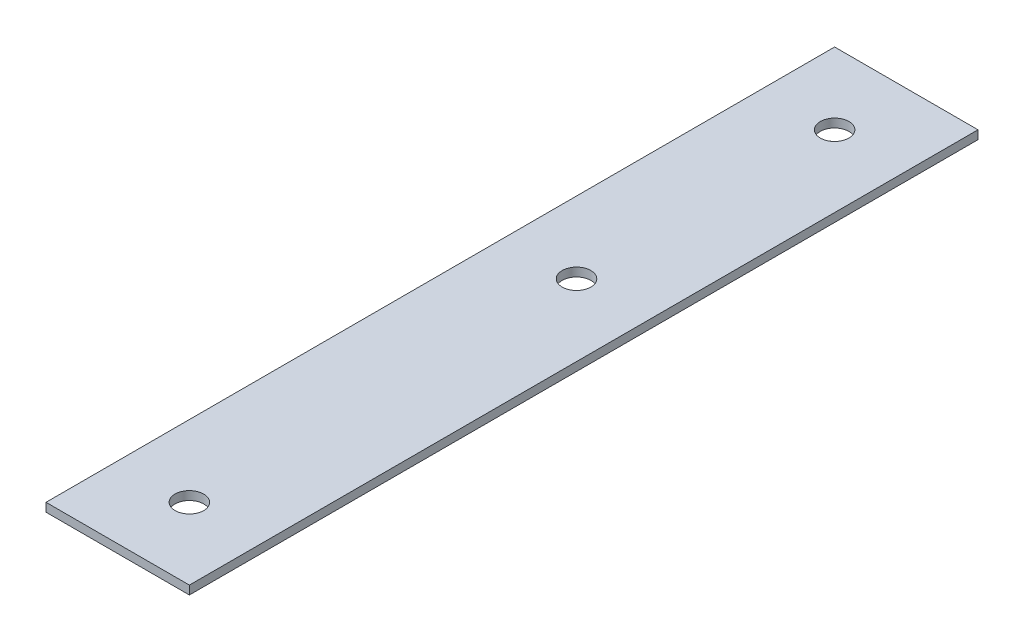
ISO-10303-21;
HEADER;
FILE_DESCRIPTION(('STEP AP214'),'2;1');
FILE_NAME('part.step','',(''),(''),'','','');
FILE_SCHEMA(('AUTOMOTIVE_DESIGN { 1 0 10303 214 1 1 1 1 }'));
ENDSEC;
DATA;
#1=APPLICATION_CONTEXT('core data for automotive mechanical design processes');
#2=APPLICATION_PROTOCOL_DEFINITION('international standard','automotive_design',2000,#1);
#3=PRODUCT_CONTEXT('',#1,'mechanical');
#4=PRODUCT('Part','Part','',(#3));
#5=PRODUCT_RELATED_PRODUCT_CATEGORY('part','',(#4));
#6=PRODUCT_DEFINITION_FORMATION('','',#4);
#7=PRODUCT_DEFINITION_CONTEXT('part definition',#1,'design');
#8=PRODUCT_DEFINITION('design','',#6,#7);
#9=PRODUCT_DEFINITION_SHAPE('','',#8);
#10=(LENGTH_UNIT() NAMED_UNIT(*) SI_UNIT(.MILLI.,.METRE.));
#11=(NAMED_UNIT(*) PLANE_ANGLE_UNIT() SI_UNIT($,.RADIAN.));
#12=(NAMED_UNIT(*) SI_UNIT($,.STERADIAN.) SOLID_ANGLE_UNIT());
#13=UNCERTAINTY_MEASURE_WITH_UNIT(LENGTH_MEASURE(1.E-05),#10,'distance_accuracy_value','');
#14=(GEOMETRIC_REPRESENTATION_CONTEXT(3) GLOBAL_UNCERTAINTY_ASSIGNED_CONTEXT((#13)) GLOBAL_UNIT_ASSIGNED_CONTEXT((#10,
#11,#12)) REPRESENTATION_CONTEXT('',''));
#15=CARTESIAN_POINT('',(0.,0.,0.));
#16=DIRECTION('',(0.,0.,1.));
#17=DIRECTION('',(1.,0.,0.));
#18=AXIS2_PLACEMENT_3D('',#15,#16,#17);
#19=CARTESIAN_POINT('',(0.,3.,0.));
#20=DIRECTION('',(1.,0.,0.));
#21=DIRECTION('',(0.,0.,-1.));
#22=AXIS2_PLACEMENT_3D('',#19,#20,#21);
#23=PLANE('',#22);
#24=DIRECTION('',(0.,0.,1.));
#25=VECTOR('',#24,1.);
#26=CARTESIAN_POINT('',(0.,0.,0.));
#27=LINE('',#26,#25);
#28=CARTESIAN_POINT('',(0.,0.,-275.));
#29=VERTEX_POINT('',#28);
#30=CARTESIAN_POINT('',(0.,0.,0.));
#31=VERTEX_POINT('',#30);
#32=EDGE_CURVE('E99',#29,#31,#27,.T.);
#33=ORIENTED_EDGE('',*,*,#32,.T.);
#34=DIRECTION('',(0.,-1.,0.));
#35=VECTOR('',#34,1.);
#36=CARTESIAN_POINT('',(0.,3.,0.));
#37=LINE('',#36,#35);
#38=CARTESIAN_POINT('',(0.,3.,0.));
#39=VERTEX_POINT('',#38);
#40=EDGE_CURVE('E11',#39,#31,#37,.T.);
#41=ORIENTED_EDGE('',*,*,#40,.F.);
#42=DIRECTION('',(0.,0.,1.));
#43=VECTOR('',#42,1.);
#44=CARTESIAN_POINT('',(0.,3.,0.));
#45=LINE('',#44,#43);
#46=CARTESIAN_POINT('',(0.,3.,-275.));
#47=VERTEX_POINT('',#46);
#48=EDGE_CURVE('E87',#47,#39,#45,.T.);
#49=ORIENTED_EDGE('',*,*,#48,.F.);
#50=DIRECTION('',(0.,-1.,0.));
#51=VECTOR('',#50,1.);
#52=CARTESIAN_POINT('',(0.,3.,-275.));
#53=LINE('',#52,#51);
#54=EDGE_CURVE('E95',#47,#29,#53,.T.);
#55=ORIENTED_EDGE('',*,*,#54,.T.);
#56=EDGE_LOOP('',(#33,#41,#49,#55));
#57=FACE_BOUND('',#56,.T.);
#58=ADVANCED_FACE('F36',(#57),#23,.F.);
#59=CARTESIAN_POINT('',(0.,3.,0.));
#60=DIRECTION('',(0.,0.,-1.));
#61=DIRECTION('',(-1.,0.,0.));
#62=AXIS2_PLACEMENT_3D('',#59,#60,#61);
#63=PLANE('',#62);
#64=DIRECTION('',(1.,0.,0.));
#65=VECTOR('',#64,1.);
#66=CARTESIAN_POINT('',(0.,0.,0.));
#67=LINE('',#66,#65);
#68=CARTESIAN_POINT('',(50.,0.,0.));
#69=VERTEX_POINT('',#68);
#70=EDGE_CURVE('E91',#31,#69,#67,.T.);
#71=ORIENTED_EDGE('',*,*,#70,.T.);
#72=DIRECTION('',(0.,-1.,0.));
#73=VECTOR('',#72,1.);
#74=CARTESIAN_POINT('',(50.,3.,0.));
#75=LINE('',#74,#73);
#76=CARTESIAN_POINT('',(50.,3.,0.));
#77=VERTEX_POINT('',#76);
#78=EDGE_CURVE('E44',#77,#69,#75,.T.);
#79=ORIENTED_EDGE('',*,*,#78,.F.);
#80=DIRECTION('',(1.,0.,0.));
#81=VECTOR('',#80,1.);
#82=CARTESIAN_POINT('',(0.,3.,0.));
#83=LINE('',#82,#81);
#84=EDGE_CURVE('E82',#39,#77,#83,.T.);
#85=ORIENTED_EDGE('',*,*,#84,.F.);
#86=ORIENTED_EDGE('',*,*,#40,.T.);
#87=EDGE_LOOP('',(#71,#79,#85,#86));
#88=FACE_BOUND('',#87,.T.);
#89=ADVANCED_FACE('F90',(#88),#63,.F.);
#90=CARTESIAN_POINT('',(50.,3.,0.));
#91=DIRECTION('',(-1.,0.,0.));
#92=DIRECTION('',(0.,0.,1.));
#93=AXIS2_PLACEMENT_3D('',#90,#91,#92);
#94=PLANE('',#93);
#95=DIRECTION('',(0.,0.,-1.));
#96=VECTOR('',#95,1.);
#97=CARTESIAN_POINT('',(50.,0.,0.));
#98=LINE('',#97,#96);
#99=CARTESIAN_POINT('',(50.,0.,-275.));
#100=VERTEX_POINT('',#99);
#101=EDGE_CURVE('E69',#69,#100,#98,.T.);
#102=ORIENTED_EDGE('',*,*,#101,.T.);
#103=DIRECTION('',(0.,-1.,0.));
#104=VECTOR('',#103,1.);
#105=CARTESIAN_POINT('',(50.,3.,-275.));
#106=LINE('',#105,#104);
#107=CARTESIAN_POINT('',(50.,3.,-275.));
#108=VERTEX_POINT('',#107);
#109=EDGE_CURVE('E92',#108,#100,#106,.T.);
#110=ORIENTED_EDGE('',*,*,#109,.F.);
#111=DIRECTION('',(0.,0.,-1.));
#112=VECTOR('',#111,1.);
#113=CARTESIAN_POINT('',(50.,3.,0.));
#114=LINE('',#113,#112);
#115=EDGE_CURVE('E85',#77,#108,#114,.T.);
#116=ORIENTED_EDGE('',*,*,#115,.F.);
#117=ORIENTED_EDGE('',*,*,#78,.T.);
#118=EDGE_LOOP('',(#102,#110,#116,#117));
#119=FACE_BOUND('',#118,.T.);
#120=ADVANCED_FACE('F93',(#119),#94,.F.);
#121=CARTESIAN_POINT('',(0.,3.,-275.));
#122=DIRECTION('',(0.,0.,1.));
#123=DIRECTION('',(1.,0.,0.));
#124=AXIS2_PLACEMENT_3D('',#121,#122,#123);
#125=PLANE('',#124);
#126=DIRECTION('',(-1.,0.,0.));
#127=VECTOR('',#126,1.);
#128=CARTESIAN_POINT('',(0.,0.,-275.));
#129=LINE('',#128,#127);
#130=EDGE_CURVE('E75',#100,#29,#129,.T.);
#131=ORIENTED_EDGE('',*,*,#130,.T.);
#132=ORIENTED_EDGE('',*,*,#54,.F.);
#133=DIRECTION('',(-1.,0.,0.));
#134=VECTOR('',#133,1.);
#135=CARTESIAN_POINT('',(0.,3.,-275.));
#136=LINE('',#135,#134);
#137=EDGE_CURVE('E52',#108,#47,#136,.T.);
#138=ORIENTED_EDGE('',*,*,#137,.F.);
#139=ORIENTED_EDGE('',*,*,#109,.T.);
#140=EDGE_LOOP('',(#131,#132,#138,#139));
#141=FACE_BOUND('',#140,.T.);
#142=ADVANCED_FACE('F107',(#141),#125,.F.);
#143=CARTESIAN_POINT('',(0.,3.,0.));
#144=DIRECTION('',(0.,-1.,0.));
#145=DIRECTION('',(0.,0.,-1.));
#146=AXIS2_PLACEMENT_3D('',#143,#144,#145);
#147=PLANE('',#146);
#148=CARTESIAN_POINT('',(25.,3.,-250.));
#149=DIRECTION('',(0.,1.,0.));
#150=DIRECTION('',(0.,0.,1.));
#151=AXIS2_PLACEMENT_3D('',#148,#149,#150);
#152=CIRCLE('',#151,5.);
#153=CARTESIAN_POINT('',(25.,3.,-245.));
#154=VERTEX_POINT('',#153);
#155=EDGE_CURVE('E125',#154,#154,#152,.T.);
#156=ORIENTED_EDGE('',*,*,#155,.F.);
#157=EDGE_LOOP('',(#156));
#158=FACE_BOUND('',#157,.T.);
#159=CARTESIAN_POINT('',(25.,3.,-25.));
#160=DIRECTION('',(0.,1.,0.));
#161=DIRECTION('',(0.,0.,1.));
#162=AXIS2_PLACEMENT_3D('',#159,#160,#161);
#163=CIRCLE('',#162,5.);
#164=CARTESIAN_POINT('',(25.,3.,-20.));
#165=VERTEX_POINT('',#164);
#166=EDGE_CURVE('E119',#165,#165,#163,.T.);
#167=ORIENTED_EDGE('',*,*,#166,.F.);
#168=EDGE_LOOP('',(#167));
#169=FACE_BOUND('',#168,.T.);
#170=CARTESIAN_POINT('',(25.,3.,-160.));
#171=DIRECTION('',(0.,1.,0.));
#172=DIRECTION('',(0.,0.,1.));
#173=AXIS2_PLACEMENT_3D('',#170,#171,#172);
#174=CIRCLE('',#173,5.);
#175=CARTESIAN_POINT('',(25.,3.,-155.));
#176=VERTEX_POINT('',#175);
#177=EDGE_CURVE('E113',#176,#176,#174,.T.);
#178=ORIENTED_EDGE('',*,*,#177,.F.);
#179=EDGE_LOOP('',(#178));
#180=FACE_BOUND('',#179,.T.);
#181=ORIENTED_EDGE('',*,*,#48,.T.);
#182=ORIENTED_EDGE('',*,*,#84,.T.);
#183=ORIENTED_EDGE('',*,*,#115,.T.);
#184=ORIENTED_EDGE('',*,*,#137,.T.);
#185=EDGE_LOOP('',(#181,#182,#183,#184));
#186=FACE_BOUND('',#185,.T.);
#187=ADVANCED_FACE('F83',(#158,#169,#180,#186),#147,.F.);
#188=CARTESIAN_POINT('',(0.,0.,0.));
#189=DIRECTION('',(0.,-1.,0.));
#190=DIRECTION('',(0.,0.,-1.));
#191=AXIS2_PLACEMENT_3D('',#188,#189,#190);
#192=PLANE('',#191);
#193=CARTESIAN_POINT('',(25.,0.,-250.));
#194=DIRECTION('',(0.,1.,0.));
#195=DIRECTION('',(0.,0.,1.));
#196=AXIS2_PLACEMENT_3D('',#193,#194,#195);
#197=CIRCLE('',#196,5.);
#198=CARTESIAN_POINT('',(25.,0.,-245.));
#199=VERTEX_POINT('',#198);
#200=EDGE_CURVE('E102',#199,#199,#197,.T.);
#201=ORIENTED_EDGE('',*,*,#200,.T.);
#202=EDGE_LOOP('',(#201));
#203=FACE_BOUND('',#202,.T.);
#204=CARTESIAN_POINT('',(25.,0.,-25.));
#205=DIRECTION('',(0.,1.,0.));
#206=DIRECTION('',(0.,0.,1.));
#207=AXIS2_PLACEMENT_3D('',#204,#205,#206);
#208=CIRCLE('',#207,5.);
#209=CARTESIAN_POINT('',(25.,0.,-20.));
#210=VERTEX_POINT('',#209);
#211=EDGE_CURVE('E122',#210,#210,#208,.T.);
#212=ORIENTED_EDGE('',*,*,#211,.T.);
#213=EDGE_LOOP('',(#212));
#214=FACE_BOUND('',#213,.T.);
#215=CARTESIAN_POINT('',(25.,0.,-160.));
#216=DIRECTION('',(0.,1.,0.));
#217=DIRECTION('',(0.,0.,1.));
#218=AXIS2_PLACEMENT_3D('',#215,#216,#217);
#219=CIRCLE('',#218,5.);
#220=CARTESIAN_POINT('',(25.,0.,-155.));
#221=VERTEX_POINT('',#220);
#222=EDGE_CURVE('E116',#221,#221,#219,.T.);
#223=ORIENTED_EDGE('',*,*,#222,.T.);
#224=EDGE_LOOP('',(#223));
#225=FACE_BOUND('',#224,.T.);
#226=ORIENTED_EDGE('',*,*,#32,.F.);
#227=ORIENTED_EDGE('',*,*,#130,.F.);
#228=ORIENTED_EDGE('',*,*,#101,.F.);
#229=ORIENTED_EDGE('',*,*,#70,.F.);
#230=EDGE_LOOP('',(#226,#227,#228,#229));
#231=FACE_BOUND('',#230,.T.);
#232=ADVANCED_FACE('F110',(#203,#214,#225,#231),#192,.T.);
#233=CARTESIAN_POINT('',(25.,0.,-160.));
#234=DIRECTION('',(0.,1.,0.));
#235=DIRECTION('',(0.,0.,1.));
#236=AXIS2_PLACEMENT_3D('',#233,#234,#235);
#237=CYLINDRICAL_SURFACE('',#236,5.);
#238=ORIENTED_EDGE('',*,*,#222,.F.);
#239=EDGE_LOOP('',(#238));
#240=FACE_BOUND('',#239,.T.);
#241=ORIENTED_EDGE('',*,*,#177,.T.);
#242=EDGE_LOOP('',(#241));
#243=FACE_BOUND('',#242,.T.);
#244=ADVANCED_FACE('F147',(#240,#243),#237,.F.);
#245=CARTESIAN_POINT('',(25.,0.,-25.));
#246=DIRECTION('',(0.,1.,0.));
#247=DIRECTION('',(0.,0.,1.));
#248=AXIS2_PLACEMENT_3D('',#245,#246,#247);
#249=CYLINDRICAL_SURFACE('',#248,5.);
#250=ORIENTED_EDGE('',*,*,#211,.F.);
#251=EDGE_LOOP('',(#250));
#252=FACE_BOUND('',#251,.T.);
#253=ORIENTED_EDGE('',*,*,#166,.T.);
#254=EDGE_LOOP('',(#253));
#255=FACE_BOUND('',#254,.T.);
#256=ADVANCED_FACE('F136',(#252,#255),#249,.F.);
#257=CARTESIAN_POINT('',(25.,0.,-250.));
#258=DIRECTION('',(0.,1.,0.));
#259=DIRECTION('',(0.,0.,1.));
#260=AXIS2_PLACEMENT_3D('',#257,#258,#259);
#261=CYLINDRICAL_SURFACE('',#260,5.);
#262=ORIENTED_EDGE('',*,*,#200,.F.);
#263=EDGE_LOOP('',(#262));
#264=FACE_BOUND('',#263,.T.);
#265=ORIENTED_EDGE('',*,*,#155,.T.);
#266=EDGE_LOOP('',(#265));
#267=FACE_BOUND('',#266,.T.);
#268=ADVANCED_FACE('F133',(#264,#267),#261,.F.);
#269=CLOSED_SHELL('',(#58,#89,#120,#142,#187,#232,#244,#256,#268));
#270=MANIFOLD_SOLID_BREP('B2',#269);
#271=ADVANCED_BREP_SHAPE_REPRESENTATION('',(#18,#270),#14);
#272=SHAPE_DEFINITION_REPRESENTATION(#9,#271);
ENDSEC;
END-ISO-10303-21;
